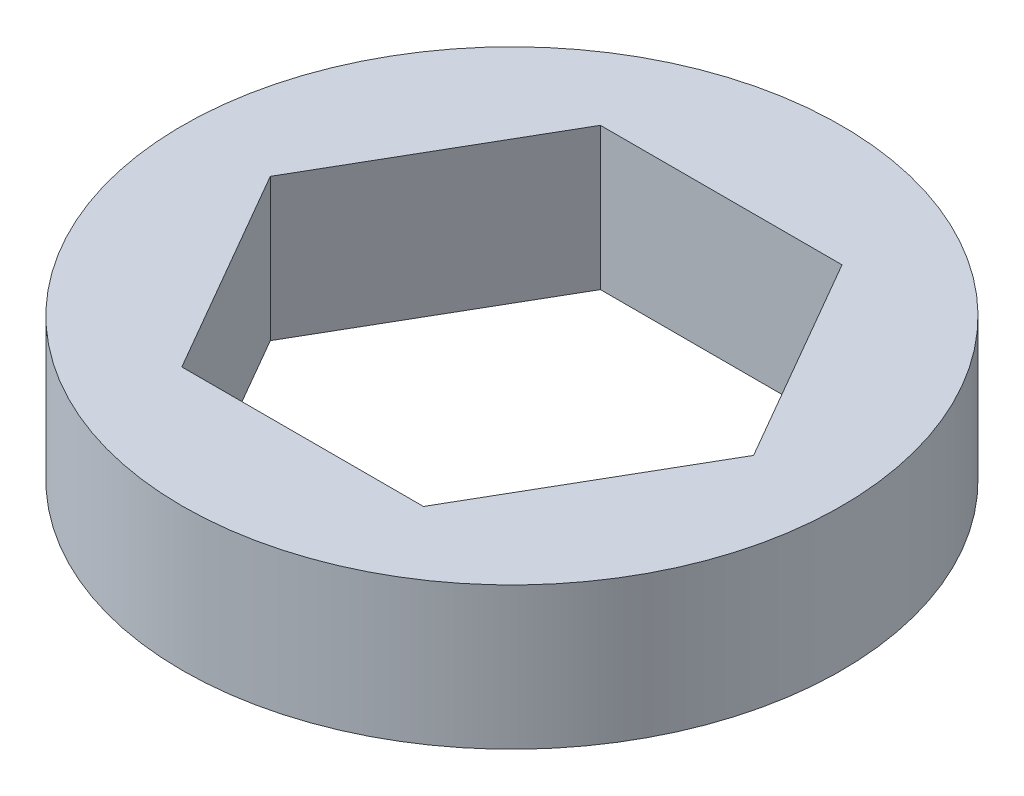
ISO-10303-21;
HEADER;
FILE_DESCRIPTION(('STEP AP214'),'2;1');
FILE_NAME('part.step','',(''),(''),'','','');
FILE_SCHEMA(('AUTOMOTIVE_DESIGN { 1 0 10303 214 1 1 1 1 }'));
ENDSEC;
DATA;
#1=APPLICATION_CONTEXT('core data for automotive mechanical design processes');
#2=APPLICATION_PROTOCOL_DEFINITION('international standard','automotive_design',2000,#1);
#3=PRODUCT_CONTEXT('',#1,'mechanical');
#4=PRODUCT('Part','Part','',(#3));
#5=PRODUCT_RELATED_PRODUCT_CATEGORY('part','',(#4));
#6=PRODUCT_DEFINITION_FORMATION('','',#4);
#7=PRODUCT_DEFINITION_CONTEXT('part definition',#1,'design');
#8=PRODUCT_DEFINITION('design','',#6,#7);
#9=PRODUCT_DEFINITION_SHAPE('','',#8);
#10=(LENGTH_UNIT() NAMED_UNIT(*) SI_UNIT(.MILLI.,.METRE.));
#11=(NAMED_UNIT(*) PLANE_ANGLE_UNIT() SI_UNIT($,.RADIAN.));
#12=(NAMED_UNIT(*) SI_UNIT($,.STERADIAN.) SOLID_ANGLE_UNIT());
#13=UNCERTAINTY_MEASURE_WITH_UNIT(LENGTH_MEASURE(1.E-05),#10,'distance_accuracy_value','');
#14=(GEOMETRIC_REPRESENTATION_CONTEXT(3) GLOBAL_UNCERTAINTY_ASSIGNED_CONTEXT((#13)) GLOBAL_UNIT_ASSIGNED_CONTEXT((#10,
#11,#12)) REPRESENTATION_CONTEXT('',''));
#15=CARTESIAN_POINT('',(0.,0.,0.));
#16=DIRECTION('',(0.,0.,1.));
#17=DIRECTION('',(1.,0.,0.));
#18=AXIS2_PLACEMENT_3D('',#15,#16,#17);
#19=CARTESIAN_POINT('',(0.,4.318,0.));
#20=DIRECTION('',(0.,1.,0.));
#21=DIRECTION('',(0.,0.,1.));
#22=AXIS2_PLACEMENT_3D('',#19,#20,#21);
#23=PLANE('',#22);
#24=CARTESIAN_POINT('',(0.,4.318,0.));
#25=DIRECTION('',(0.,1.,0.));
#26=DIRECTION('',(0.,0.,1.));
#27=AXIS2_PLACEMENT_3D('',#24,#25,#26);
#28=CIRCLE('',#27,10.);
#29=CARTESIAN_POINT('',(0.,4.318,10.));
#30=VERTEX_POINT('',#29);
#31=EDGE_CURVE('E11',#30,#30,#28,.T.);
#32=ORIENTED_EDGE('',*,*,#31,.T.);
#33=EDGE_LOOP('',(#32));
#34=FACE_BOUND('',#33,.T.);
#35=DIRECTION('',(0.5,0.,0.866025403784439));
#36=VECTOR('',#35,1.);
#37=CARTESIAN_POINT('',(-7.33234841870825,4.318,0.));
#38=LINE('',#37,#36);
#39=CARTESIAN_POINT('',(-7.33234841870825,4.318,0.));
#40=VERTEX_POINT('',#39);
#41=CARTESIAN_POINT('',(-3.66617420935413,4.318,6.35));
#42=VERTEX_POINT('',#41);
#43=EDGE_CURVE('E93',#40,#42,#38,.T.);
#44=ORIENTED_EDGE('',*,*,#43,.F.);
#45=DIRECTION('',(-0.5,0.,0.866025403784439));
#46=VECTOR('',#45,1.);
#47=CARTESIAN_POINT('',(-3.66617420935412,4.318,-6.35));
#48=LINE('',#47,#46);
#49=CARTESIAN_POINT('',(-3.66617420935412,4.318,-6.35));
#50=VERTEX_POINT('',#49);
#51=EDGE_CURVE('E85',#50,#40,#48,.T.);
#52=ORIENTED_EDGE('',*,*,#51,.F.);
#53=DIRECTION('',(-1.,0.,0.));
#54=VECTOR('',#53,1.);
#55=CARTESIAN_POINT('',(3.66617420935412,4.318,-6.35));
#56=LINE('',#55,#54);
#57=CARTESIAN_POINT('',(3.66617420935412,4.318,-6.35));
#58=VERTEX_POINT('',#57);
#59=EDGE_CURVE('E113',#58,#50,#56,.T.);
#60=ORIENTED_EDGE('',*,*,#59,.F.);
#61=DIRECTION('',(-0.5,0.,-0.866025403784439));
#62=VECTOR('',#61,1.);
#63=CARTESIAN_POINT('',(7.33234841870825,4.318,0.));
#64=LINE('',#63,#62);
#65=CARTESIAN_POINT('',(7.33234841870825,4.318,0.));
#66=VERTEX_POINT('',#65);
#67=EDGE_CURVE('E111',#66,#58,#64,.T.);
#68=ORIENTED_EDGE('',*,*,#67,.F.);
#69=DIRECTION('',(0.5,0.,-0.866025403784439));
#70=VECTOR('',#69,1.);
#71=CARTESIAN_POINT('',(3.66617420935412,4.318,6.35));
#72=LINE('',#71,#70);
#73=CARTESIAN_POINT('',(3.66617420935412,4.318,6.35));
#74=VERTEX_POINT('',#73);
#75=EDGE_CURVE('E107',#74,#66,#72,.T.);
#76=ORIENTED_EDGE('',*,*,#75,.F.);
#77=DIRECTION('',(1.,0.,0.));
#78=VECTOR('',#77,1.);
#79=CARTESIAN_POINT('',(-3.66617420935413,4.318,6.35));
#80=LINE('',#79,#78);
#81=EDGE_CURVE('E105',#42,#74,#80,.T.);
#82=ORIENTED_EDGE('',*,*,#81,.F.);
#83=EDGE_LOOP('',(#44,#52,#60,#68,#76,#82));
#84=FACE_BOUND('',#83,.T.);
#85=ADVANCED_FACE('F32',(#34,#84),#23,.T.);
#86=CARTESIAN_POINT('',(0.,0.,0.));
#87=DIRECTION('',(0.,1.,0.));
#88=DIRECTION('',(0.,0.,1.));
#89=AXIS2_PLACEMENT_3D('',#86,#87,#88);
#90=PLANE('',#89);
#91=CARTESIAN_POINT('',(0.,0.,0.));
#92=DIRECTION('',(0.,1.,0.));
#93=DIRECTION('',(0.,0.,1.));
#94=AXIS2_PLACEMENT_3D('',#91,#92,#93);
#95=CIRCLE('',#94,10.);
#96=CARTESIAN_POINT('',(0.,0.,10.));
#97=VERTEX_POINT('',#96);
#98=EDGE_CURVE('E36',#97,#97,#95,.T.);
#99=ORIENTED_EDGE('',*,*,#98,.F.);
#100=EDGE_LOOP('',(#99));
#101=FACE_BOUND('',#100,.T.);
#102=DIRECTION('',(-0.5,0.,0.866025403784439));
#103=VECTOR('',#102,1.);
#104=CARTESIAN_POINT('',(-3.66617420935412,0.,-6.35));
#105=LINE('',#104,#103);
#106=CARTESIAN_POINT('',(-3.66617420935412,0.,-6.35));
#107=VERTEX_POINT('',#106);
#108=CARTESIAN_POINT('',(-7.33234841870825,0.,0.));
#109=VERTEX_POINT('',#108);
#110=EDGE_CURVE('E55',#107,#109,#105,.T.);
#111=ORIENTED_EDGE('',*,*,#110,.T.);
#112=DIRECTION('',(0.5,0.,0.866025403784439));
#113=VECTOR('',#112,1.);
#114=CARTESIAN_POINT('',(-7.33234841870825,0.,0.));
#115=LINE('',#114,#113);
#116=CARTESIAN_POINT('',(-3.66617420935413,0.,6.35));
#117=VERTEX_POINT('',#116);
#118=EDGE_CURVE('E100',#109,#117,#115,.T.);
#119=ORIENTED_EDGE('',*,*,#118,.T.);
#120=DIRECTION('',(1.,0.,0.));
#121=VECTOR('',#120,1.);
#122=CARTESIAN_POINT('',(-3.66617420935413,0.,6.35));
#123=LINE('',#122,#121);
#124=CARTESIAN_POINT('',(3.66617420935412,0.,6.35));
#125=VERTEX_POINT('',#124);
#126=EDGE_CURVE('E117',#117,#125,#123,.T.);
#127=ORIENTED_EDGE('',*,*,#126,.T.);
#128=DIRECTION('',(0.5,0.,-0.866025403784439));
#129=VECTOR('',#128,1.);
#130=CARTESIAN_POINT('',(3.66617420935412,0.,6.35));
#131=LINE('',#130,#129);
#132=CARTESIAN_POINT('',(7.33234841870825,0.,0.));
#133=VERTEX_POINT('',#132);
#134=EDGE_CURVE('E120',#125,#133,#131,.T.);
#135=ORIENTED_EDGE('',*,*,#134,.T.);
#136=DIRECTION('',(-0.5,0.,-0.866025403784439));
#137=VECTOR('',#136,1.);
#138=CARTESIAN_POINT('',(7.33234841870825,0.,0.));
#139=LINE('',#138,#137);
#140=CARTESIAN_POINT('',(3.66617420935412,0.,-6.35));
#141=VERTEX_POINT('',#140);
#142=EDGE_CURVE('E123',#133,#141,#139,.T.);
#143=ORIENTED_EDGE('',*,*,#142,.T.);
#144=DIRECTION('',(-1.,0.,0.));
#145=VECTOR('',#144,1.);
#146=CARTESIAN_POINT('',(3.66617420935412,0.,-6.35));
#147=LINE('',#146,#145);
#148=EDGE_CURVE('E94',#141,#107,#147,.T.);
#149=ORIENTED_EDGE('',*,*,#148,.T.);
#150=EDGE_LOOP('',(#111,#119,#127,#135,#143,#149));
#151=FACE_BOUND('',#150,.T.);
#152=ADVANCED_FACE('F140',(#101,#151),#90,.F.);
#153=CARTESIAN_POINT('',(0.,4.318,0.));
#154=DIRECTION('',(0.,-1.,0.));
#155=DIRECTION('',(0.,0.,-1.));
#156=AXIS2_PLACEMENT_3D('',#153,#154,#155);
#157=CYLINDRICAL_SURFACE('',#156,10.);
#158=ORIENTED_EDGE('',*,*,#31,.F.);
#159=EDGE_LOOP('',(#158));
#160=FACE_BOUND('',#159,.T.);
#161=ORIENTED_EDGE('',*,*,#98,.T.);
#162=EDGE_LOOP('',(#161));
#163=FACE_BOUND('',#162,.T.);
#164=ADVANCED_FACE('F34',(#160,#163),#157,.T.);
#165=CARTESIAN_POINT('',(-3.66617420935412,4.318,-6.35));
#166=DIRECTION('',(0.866025403784439,0.,0.5));
#167=DIRECTION('',(0.5,0.,-0.866025403784439));
#168=AXIS2_PLACEMENT_3D('',#165,#166,#167);
#169=PLANE('',#168);
#170=ORIENTED_EDGE('',*,*,#110,.F.);
#171=DIRECTION('',(0.,-1.,0.));
#172=VECTOR('',#171,1.);
#173=CARTESIAN_POINT('',(-3.66617420935412,4.318,-6.35));
#174=LINE('',#173,#172);
#175=EDGE_CURVE('E89',#50,#107,#174,.T.);
#176=ORIENTED_EDGE('',*,*,#175,.F.);
#177=ORIENTED_EDGE('',*,*,#51,.T.);
#178=DIRECTION('',(0.,-1.,0.));
#179=VECTOR('',#178,1.);
#180=CARTESIAN_POINT('',(-7.33234841870825,4.318,0.));
#181=LINE('',#180,#179);
#182=EDGE_CURVE('E88',#40,#109,#181,.T.);
#183=ORIENTED_EDGE('',*,*,#182,.T.);
#184=EDGE_LOOP('',(#170,#176,#177,#183));
#185=FACE_BOUND('',#184,.T.);
#186=ADVANCED_FACE('F87',(#185),#169,.T.);
#187=CARTESIAN_POINT('',(-7.33234841870825,4.318,0.));
#188=DIRECTION('',(0.866025403784439,0.,-0.5));
#189=DIRECTION('',(-0.5,0.,-0.866025403784439));
#190=AXIS2_PLACEMENT_3D('',#187,#188,#189);
#191=PLANE('',#190);
#192=ORIENTED_EDGE('',*,*,#118,.F.);
#193=ORIENTED_EDGE('',*,*,#182,.F.);
#194=ORIENTED_EDGE('',*,*,#43,.T.);
#195=DIRECTION('',(0.,-1.,0.));
#196=VECTOR('',#195,1.);
#197=CARTESIAN_POINT('',(-3.66617420935413,4.318,6.35));
#198=LINE('',#197,#196);
#199=EDGE_CURVE('E101',#42,#117,#198,.T.);
#200=ORIENTED_EDGE('',*,*,#199,.T.);
#201=EDGE_LOOP('',(#192,#193,#194,#200));
#202=FACE_BOUND('',#201,.T.);
#203=ADVANCED_FACE('F97',(#202),#191,.T.);
#204=CARTESIAN_POINT('',(-3.66617420935413,4.318,6.35));
#205=DIRECTION('',(0.,0.,-1.));
#206=DIRECTION('',(-1.,0.,0.));
#207=AXIS2_PLACEMENT_3D('',#204,#205,#206);
#208=PLANE('',#207);
#209=ORIENTED_EDGE('',*,*,#126,.F.);
#210=ORIENTED_EDGE('',*,*,#199,.F.);
#211=ORIENTED_EDGE('',*,*,#81,.T.);
#212=DIRECTION('',(0.,-1.,0.));
#213=VECTOR('',#212,1.);
#214=CARTESIAN_POINT('',(3.66617420935412,4.318,6.35));
#215=LINE('',#214,#213);
#216=EDGE_CURVE('E132',#74,#125,#215,.T.);
#217=ORIENTED_EDGE('',*,*,#216,.T.);
#218=EDGE_LOOP('',(#209,#210,#211,#217));
#219=FACE_BOUND('',#218,.T.);
#220=ADVANCED_FACE('F136',(#219),#208,.T.);
#221=CARTESIAN_POINT('',(3.66617420935412,4.318,6.35));
#222=DIRECTION('',(-0.866025403784439,0.,-0.5));
#223=DIRECTION('',(-0.5,0.,0.866025403784439));
#224=AXIS2_PLACEMENT_3D('',#221,#222,#223);
#225=PLANE('',#224);
#226=ORIENTED_EDGE('',*,*,#134,.F.);
#227=ORIENTED_EDGE('',*,*,#216,.F.);
#228=ORIENTED_EDGE('',*,*,#75,.T.);
#229=DIRECTION('',(0.,-1.,0.));
#230=VECTOR('',#229,1.);
#231=CARTESIAN_POINT('',(7.33234841870825,4.318,0.));
#232=LINE('',#231,#230);
#233=EDGE_CURVE('E130',#66,#133,#232,.T.);
#234=ORIENTED_EDGE('',*,*,#233,.T.);
#235=EDGE_LOOP('',(#226,#227,#228,#234));
#236=FACE_BOUND('',#235,.T.);
#237=ADVANCED_FACE('F148',(#236),#225,.T.);
#238=CARTESIAN_POINT('',(7.33234841870825,4.318,0.));
#239=DIRECTION('',(-0.866025403784439,0.,0.5));
#240=DIRECTION('',(0.5,0.,0.866025403784439));
#241=AXIS2_PLACEMENT_3D('',#238,#239,#240);
#242=PLANE('',#241);
#243=ORIENTED_EDGE('',*,*,#142,.F.);
#244=ORIENTED_EDGE('',*,*,#233,.F.);
#245=ORIENTED_EDGE('',*,*,#67,.T.);
#246=DIRECTION('',(0.,-1.,0.));
#247=VECTOR('',#246,1.);
#248=CARTESIAN_POINT('',(3.66617420935412,4.318,-6.35));
#249=LINE('',#248,#247);
#250=EDGE_CURVE('E47',#58,#141,#249,.T.);
#251=ORIENTED_EDGE('',*,*,#250,.T.);
#252=EDGE_LOOP('',(#243,#244,#245,#251));
#253=FACE_BOUND('',#252,.T.);
#254=ADVANCED_FACE('F146',(#253),#242,.T.);
#255=CARTESIAN_POINT('',(3.66617420935412,4.318,-6.35));
#256=DIRECTION('',(0.,0.,1.));
#257=DIRECTION('',(1.,0.,0.));
#258=AXIS2_PLACEMENT_3D('',#255,#256,#257);
#259=PLANE('',#258);
#260=ORIENTED_EDGE('',*,*,#148,.F.);
#261=ORIENTED_EDGE('',*,*,#250,.F.);
#262=ORIENTED_EDGE('',*,*,#59,.T.);
#263=ORIENTED_EDGE('',*,*,#175,.T.);
#264=EDGE_LOOP('',(#260,#261,#262,#263));
#265=FACE_BOUND('',#264,.T.);
#266=ADVANCED_FACE('F142',(#265),#259,.T.);
#267=CLOSED_SHELL('',(#85,#152,#164,#186,#203,#220,#237,#254,#266));
#268=MANIFOLD_SOLID_BREP('B2',#267);
#269=ADVANCED_BREP_SHAPE_REPRESENTATION('',(#18,#268),#14);
#270=SHAPE_DEFINITION_REPRESENTATION(#9,#269);
ENDSEC;
END-ISO-10303-21;
